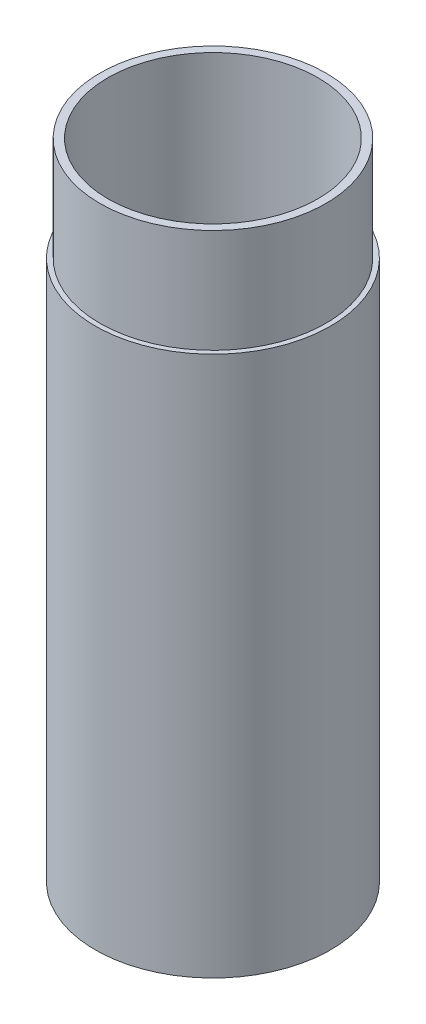
ISO-10303-21;
HEADER;
FILE_DESCRIPTION(('STEP AP214'),'2;1');
FILE_NAME('part.step','',(''),(''),'','','');
FILE_SCHEMA(('AUTOMOTIVE_DESIGN { 1 0 10303 214 1 1 1 1 }'));
ENDSEC;
DATA;
#1=APPLICATION_CONTEXT('core data for automotive mechanical design processes');
#2=APPLICATION_PROTOCOL_DEFINITION('international standard','automotive_design',2000,#1);
#3=PRODUCT_CONTEXT('',#1,'mechanical');
#4=PRODUCT('Part','Part','',(#3));
#5=PRODUCT_RELATED_PRODUCT_CATEGORY('part','',(#4));
#6=PRODUCT_DEFINITION_FORMATION('','',#4);
#7=PRODUCT_DEFINITION_CONTEXT('part definition',#1,'design');
#8=PRODUCT_DEFINITION('design','',#6,#7);
#9=PRODUCT_DEFINITION_SHAPE('','',#8);
#10=(LENGTH_UNIT() NAMED_UNIT(*) SI_UNIT(.MILLI.,.METRE.));
#11=(NAMED_UNIT(*) PLANE_ANGLE_UNIT() SI_UNIT($,.RADIAN.));
#12=(NAMED_UNIT(*) SI_UNIT($,.STERADIAN.) SOLID_ANGLE_UNIT());
#13=UNCERTAINTY_MEASURE_WITH_UNIT(LENGTH_MEASURE(1.E-05),#10,'distance_accuracy_value','');
#14=(GEOMETRIC_REPRESENTATION_CONTEXT(3) GLOBAL_UNCERTAINTY_ASSIGNED_CONTEXT((#13)) GLOBAL_UNIT_ASSIGNED_CONTEXT((#10,
#11,#12)) REPRESENTATION_CONTEXT('',''));
#15=CARTESIAN_POINT('',(0.,0.,0.));
#16=DIRECTION('',(0.,0.,1.));
#17=DIRECTION('',(1.,0.,0.));
#18=AXIS2_PLACEMENT_3D('',#15,#16,#17);
#19=CARTESIAN_POINT('',(0.,114.5,0.));
#20=DIRECTION('',(0.,1.,0.));
#21=DIRECTION('',(0.,0.,1.));
#22=AXIS2_PLACEMENT_3D('',#19,#20,#21);
#23=PLANE('',#22);
#24=CARTESIAN_POINT('',(0.,114.5,0.));
#25=DIRECTION('',(0.,1.,0.));
#26=DIRECTION('',(0.,0.,1.));
#27=AXIS2_PLACEMENT_3D('',#24,#25,#26);
#28=CIRCLE('',#27,23.95);
#29=CARTESIAN_POINT('',(0.,114.5,23.95));
#30=VERTEX_POINT('',#29);
#31=EDGE_CURVE('E58',#30,#30,#28,.T.);
#32=ORIENTED_EDGE('',*,*,#31,.F.);
#33=EDGE_LOOP('',(#32));
#34=FACE_BOUND('',#33,.T.);
#35=CARTESIAN_POINT('',(0.,114.5,0.));
#36=DIRECTION('',(0.,1.,0.));
#37=DIRECTION('',(0.,0.,1.));
#38=AXIS2_PLACEMENT_3D('',#35,#36,#37);
#39=CIRCLE('',#38,24.95);
#40=CARTESIAN_POINT('',(0.,114.5,-24.95));
#41=VERTEX_POINT('',#40);
#42=EDGE_CURVE('E62',#41,#41,#39,.T.);
#43=ORIENTED_EDGE('',*,*,#42,.T.);
#44=EDGE_LOOP('',(#43));
#45=FACE_BOUND('',#44,.T.);
#46=ADVANCED_FACE('F38',(#34,#45),#23,.T.);
#47=CARTESIAN_POINT('',(0.,0.,0.));
#48=DIRECTION('',(0.,1.,0.));
#49=DIRECTION('',(0.,0.,1.));
#50=AXIS2_PLACEMENT_3D('',#47,#48,#49);
#51=PLANE('',#50);
#52=CARTESIAN_POINT('',(0.,0.,0.));
#53=DIRECTION('',(0.,1.,0.));
#54=DIRECTION('',(0.,0.,1.));
#55=AXIS2_PLACEMENT_3D('',#52,#53,#54);
#56=CIRCLE('',#55,23.6642135623731);
#57=CARTESIAN_POINT('',(0.,0.,23.6642135623731));
#58=VERTEX_POINT('',#57);
#59=EDGE_CURVE('E53',#58,#58,#56,.T.);
#60=ORIENTED_EDGE('',*,*,#59,.T.);
#61=EDGE_LOOP('',(#60));
#62=FACE_BOUND('',#61,.T.);
#63=CARTESIAN_POINT('',(0.,0.,0.));
#64=DIRECTION('',(0.,1.,0.));
#65=DIRECTION('',(0.,0.,1.));
#66=AXIS2_PLACEMENT_3D('',#63,#64,#65);
#67=CIRCLE('',#66,24.95);
#68=CARTESIAN_POINT('',(0.,0.,-24.95));
#69=VERTEX_POINT('',#68);
#70=EDGE_CURVE('E59',#69,#69,#67,.T.);
#71=ORIENTED_EDGE('',*,*,#70,.F.);
#72=EDGE_LOOP('',(#71));
#73=FACE_BOUND('',#72,.T.);
#74=ADVANCED_FACE('F91',(#62,#73),#51,.F.);
#75=CARTESIAN_POINT('',(0.,114.5,0.));
#76=DIRECTION('',(0.,-1.,0.));
#77=DIRECTION('',(0.,0.,-1.));
#78=AXIS2_PLACEMENT_3D('',#75,#76,#77);
#79=CYLINDRICAL_SURFACE('',#78,24.95);
#80=CARTESIAN_POINT('',(0.,114.5,-24.95));
#81=CARTESIAN_POINT('',(0.,113.307291666667,-24.95));
#82=CARTESIAN_POINT('',(0.,112.114583333333,-24.95));
#83=CARTESIAN_POINT('',(0.,109.729166666667,-24.95));
#84=CARTESIAN_POINT('',(0.,108.536458333333,-24.95));
#85=CARTESIAN_POINT('',(0.,106.151041666667,-24.95));
#86=CARTESIAN_POINT('',(0.,104.958333333333,-24.95));
#87=CARTESIAN_POINT('',(0.,102.572916666667,-24.95));
#88=CARTESIAN_POINT('',(0.,101.380208333333,-24.95));
#89=CARTESIAN_POINT('',(0.,98.9947916666667,-24.95));
#90=CARTESIAN_POINT('',(0.,97.8020833333333,-24.95));
#91=CARTESIAN_POINT('',(0.,95.4166666666667,-24.95));
#92=CARTESIAN_POINT('',(0.,94.2239583333333,-24.95));
#93=CARTESIAN_POINT('',(0.,91.8385416666667,-24.95));
#94=CARTESIAN_POINT('',(0.,90.6458333333333,-24.95));
#95=CARTESIAN_POINT('',(0.,88.2604166666667,-24.95));
#96=CARTESIAN_POINT('',(0.,87.0677083333333,-24.95));
#97=CARTESIAN_POINT('',(0.,84.6822916666667,-24.95));
#98=CARTESIAN_POINT('',(0.,83.4895833333333,-24.95));
#99=CARTESIAN_POINT('',(0.,81.1041666666667,-24.95));
#100=CARTESIAN_POINT('',(0.,79.9114583333333,-24.95));
#101=CARTESIAN_POINT('',(0.,77.5260416666667,-24.95));
#102=CARTESIAN_POINT('',(0.,76.3333333333333,-24.95));
#103=CARTESIAN_POINT('',(0.,73.9479166666667,-24.95));
#104=CARTESIAN_POINT('',(0.,72.7552083333333,-24.95));
#105=CARTESIAN_POINT('',(0.,70.3697916666667,-24.95));
#106=CARTESIAN_POINT('',(0.,69.1770833333333,-24.95));
#107=CARTESIAN_POINT('',(0.,66.7916666666667,-24.95));
#108=CARTESIAN_POINT('',(0.,65.5989583333333,-24.95));
#109=CARTESIAN_POINT('',(0.,63.2135416666667,-24.95));
#110=CARTESIAN_POINT('',(0.,62.0208333333333,-24.95));
#111=CARTESIAN_POINT('',(0.,59.6354166666667,-24.95));
#112=CARTESIAN_POINT('',(0.,58.4427083333333,-24.95));
#113=CARTESIAN_POINT('',(0.,56.0572916666667,-24.95));
#114=CARTESIAN_POINT('',(0.,54.8645833333333,-24.95));
#115=CARTESIAN_POINT('',(0.,52.4791666666667,-24.95));
#116=CARTESIAN_POINT('',(0.,51.2864583333333,-24.95));
#117=CARTESIAN_POINT('',(0.,48.9010416666667,-24.95));
#118=CARTESIAN_POINT('',(0.,47.7083333333333,-24.95));
#119=CARTESIAN_POINT('',(0.,45.3229166666667,-24.95));
#120=CARTESIAN_POINT('',(0.,44.1302083333333,-24.95));
#121=CARTESIAN_POINT('',(0.,41.7447916666667,-24.95));
#122=CARTESIAN_POINT('',(0.,40.5520833333333,-24.95));
#123=CARTESIAN_POINT('',(0.,38.1666666666667,-24.95));
#124=CARTESIAN_POINT('',(0.,36.9739583333333,-24.95));
#125=CARTESIAN_POINT('',(0.,34.5885416666667,-24.95));
#126=CARTESIAN_POINT('',(0.,33.3958333333333,-24.95));
#127=CARTESIAN_POINT('',(0.,31.0104166666667,-24.95));
#128=CARTESIAN_POINT('',(0.,29.8177083333333,-24.95));
#129=CARTESIAN_POINT('',(0.,27.4322916666667,-24.95));
#130=CARTESIAN_POINT('',(0.,26.2395833333333,-24.95));
#131=CARTESIAN_POINT('',(0.,23.8541666666667,-24.95));
#132=CARTESIAN_POINT('',(0.,22.6614583333333,-24.95));
#133=CARTESIAN_POINT('',(0.,20.2760416666667,-24.95));
#134=CARTESIAN_POINT('',(0.,19.0833333333333,-24.95));
#135=CARTESIAN_POINT('',(0.,16.6979166666667,-24.95));
#136=CARTESIAN_POINT('',(0.,15.5052083333333,-24.95));
#137=CARTESIAN_POINT('',(0.,13.1197916666667,-24.95));
#138=CARTESIAN_POINT('',(0.,11.9270833333333,-24.95));
#139=CARTESIAN_POINT('',(0.,9.54166666666667,-24.95));
#140=CARTESIAN_POINT('',(0.,8.34895833333334,-24.95));
#141=CARTESIAN_POINT('',(0.,5.96354166666667,-24.95));
#142=CARTESIAN_POINT('',(0.,4.77083333333334,-24.95));
#143=CARTESIAN_POINT('',(0.,2.38541666666667,-24.95));
#144=CARTESIAN_POINT('',(0.,1.19270833333333,-24.95));
#145=CARTESIAN_POINT('',(0.,0.,-24.95));
#146=B_SPLINE_CURVE_WITH_KNOTS('',3,(#80,#81,#82,#83,#84,#85,#86,#87,#88,#89,#90,#91,#92,#93,
#94,#95,#96,#97,#98,#99,#100,#101,#102,#103,#104,#105,#106,#107,#108,#109,#110,#111,#112,#113,
#114,#115,#116,#117,#118,#119,#120,#121,#122,#123,#124,#125,#126,#127,#128,#129,#130,#131,#132,
#133,#134,#135,#136,#137,#138,#139,#140,#141,#142,#143,#144,#145),.UNSPECIFIED.,.F.,.F.,(4,2,2,
2,2,2,2,2,2,2,2,2,2,2,2,2,2,2,2,2,2,2,2,2,2,2,2,2,2,2,2,2,4),(0.,3.57812499999999,
7.15624999999999,10.734375,14.3125,17.890625,21.46875,25.046875,28.625,32.203125,35.78125,
39.359375,42.9375,46.515625,50.09375,53.671875,57.25,60.828125,64.40625,67.984375,71.5625,
75.140625,78.71875,82.296875,85.875,89.453125,93.03125,96.609375,100.1875,103.765625,107.34375,
110.921875,114.5),.UNSPECIFIED.);
#147=EDGE_CURVE('BSEAM88',#41,#69,#146,.T.);
#148=ORIENTED_EDGE('',*,*,#42,.F.);
#149=ORIENTED_EDGE('',*,*,#70,.T.);
#150=ORIENTED_EDGE('',*,*,#147,.T.);
#151=ORIENTED_EDGE('',*,*,#147,.F.);
#152=EDGE_LOOP('',(#148,#150,#149,#151));
#153=FACE_BOUND('',#152,.T.);
#154=ADVANCED_FACE('F88',(#153),#79,.T.);
#155=CARTESIAN_POINT('',(0.,114.5,0.));
#156=DIRECTION('',(0.,-1.,0.));
#157=DIRECTION('',(0.,0.,-1.));
#158=AXIS2_PLACEMENT_3D('',#155,#156,#157);
#159=CYLINDRICAL_SURFACE('',#158,22.25);
#160=CARTESIAN_POINT('',(0.,1.41421356237306,0.));
#161=DIRECTION('',(0.,1.,0.));
#162=DIRECTION('',(0.,0.,1.));
#163=AXIS2_PLACEMENT_3D('',#160,#161,#162);
#164=CIRCLE('',#163,22.25);
#165=CARTESIAN_POINT('',(0.,1.41421356237306,-22.25));
#166=VERTEX_POINT('',#165);
#167=EDGE_CURVE('E10',#166,#166,#164,.F.);
#168=CARTESIAN_POINT('',(0.,136.5,0.));
#169=DIRECTION('',(0.,1.,0.));
#170=DIRECTION('',(0.,0.,1.));
#171=AXIS2_PLACEMENT_3D('',#168,#169,#170);
#172=CIRCLE('',#171,22.25);
#173=CARTESIAN_POINT('',(0.,136.5,-22.25));
#174=VERTEX_POINT('',#173);
#175=EDGE_CURVE('E70',#174,#174,#172,.T.);
#176=CARTESIAN_POINT('',(0.,1.41421356237306,-22.25));
#177=CARTESIAN_POINT('',(0.,2.82135717109835,-22.25));
#178=CARTESIAN_POINT('',(0.,4.22850077982363,-22.25));
#179=CARTESIAN_POINT('',(0.,7.04278799727419,-22.25));
#180=CARTESIAN_POINT('',(0.,8.44993160599947,-22.25));
#181=CARTESIAN_POINT('',(0.,11.26421882345,-22.25));
#182=CARTESIAN_POINT('',(0.,12.6713624321753,-22.25));
#183=CARTESIAN_POINT('',(0.,15.4856496496259,-22.25));
#184=CARTESIAN_POINT('',(0.,16.8927932583511,-22.25));
#185=CARTESIAN_POINT('',(0.,19.7070804758017,-22.25));
#186=CARTESIAN_POINT('',(0.,21.114224084527,-22.25));
#187=CARTESIAN_POINT('',(0.,23.9285113019776,-22.25));
#188=CARTESIAN_POINT('',(0.,25.3356549107028,-22.25));
#189=CARTESIAN_POINT('',(0.,28.1499421281534,-22.25));
#190=CARTESIAN_POINT('',(0.,29.5570857368787,-22.25));
#191=CARTESIAN_POINT('',(0.,32.3713729543292,-22.25));
#192=CARTESIAN_POINT('',(0.,33.7785165630545,-22.25));
#193=CARTESIAN_POINT('',(0.,36.5928037805051,-22.25));
#194=CARTESIAN_POINT('',(0.,37.9999473892304,-22.25));
#195=CARTESIAN_POINT('',(0.,40.8142346066809,-22.25));
#196=CARTESIAN_POINT('',(0.,42.2213782154062,-22.25));
#197=CARTESIAN_POINT('',(0.,45.0356654328568,-22.25));
#198=CARTESIAN_POINT('',(0.,46.442809041582,-22.25));
#199=CARTESIAN_POINT('',(0.,49.2570962590326,-22.25));
#200=CARTESIAN_POINT('',(0.,50.6642398677579,-22.25));
#201=CARTESIAN_POINT('',(0.,53.4785270852084,-22.25));
#202=CARTESIAN_POINT('',(0.,54.8856706939337,-22.25));
#203=CARTESIAN_POINT('',(0.,57.6999579113843,-22.25));
#204=CARTESIAN_POINT('',(0.,59.1071015201096,-22.25));
#205=CARTESIAN_POINT('',(0.,61.9213887375601,-22.25));
#206=CARTESIAN_POINT('',(0.,63.3285323462854,-22.25));
#207=CARTESIAN_POINT('',(0.,66.142819563736,-22.25));
#208=CARTESIAN_POINT('',(0.,67.5499631724612,-22.25));
#209=CARTESIAN_POINT('',(0.,70.3642503899118,-22.25));
#210=CARTESIAN_POINT('',(0.,71.7713939986371,-22.25));
#211=CARTESIAN_POINT('',(0.,74.5856812160877,-22.25));
#212=CARTESIAN_POINT('',(0.,75.9928248248129,-22.25));
#213=CARTESIAN_POINT('',(0.,78.8071120422635,-22.25));
#214=CARTESIAN_POINT('',(0.,80.2142556509888,-22.25));
#215=CARTESIAN_POINT('',(0.,83.0285428684393,-22.25));
#216=CARTESIAN_POINT('',(0.,84.4356864771646,-22.25));
#217=CARTESIAN_POINT('',(0.,87.2499736946152,-22.25));
#218=CARTESIAN_POINT('',(0.,88.6571173033405,-22.25));
#219=CARTESIAN_POINT('',(0.,91.471404520791,-22.25));
#220=CARTESIAN_POINT('',(0.,92.8785481295163,-22.25));
#221=CARTESIAN_POINT('',(0.,95.6928353469668,-22.25));
#222=CARTESIAN_POINT('',(0.,97.0999789556921,-22.25));
#223=CARTESIAN_POINT('',(0.,99.9142661731427,-22.25));
#224=CARTESIAN_POINT('',(0.,101.321409781868,-22.25));
#225=CARTESIAN_POINT('',(0.,104.135696999319,-22.25));
#226=CARTESIAN_POINT('',(0.,105.542840608044,-22.25));
#227=CARTESIAN_POINT('',(0.,108.357127825494,-22.25));
#228=CARTESIAN_POINT('',(0.,109.76427143422,-22.25));
#229=CARTESIAN_POINT('',(0.,112.57855865167,-22.25));
#230=CARTESIAN_POINT('',(0.,113.985702260395,-22.25));
#231=CARTESIAN_POINT('',(0.,116.799989477846,-22.25));
#232=CARTESIAN_POINT('',(0.,118.207133086571,-22.25));
#233=CARTESIAN_POINT('',(0.,121.021420304022,-22.25));
#234=CARTESIAN_POINT('',(0.,122.428563912747,-22.25));
#235=CARTESIAN_POINT('',(0.,125.242851130198,-22.25));
#236=CARTESIAN_POINT('',(0.,126.649994738923,-22.25));
#237=CARTESIAN_POINT('',(0.,129.464281956374,-22.25));
#238=CARTESIAN_POINT('',(0.,130.871425565099,-22.25));
#239=CARTESIAN_POINT('',(0.,133.685712782549,-22.25));
#240=CARTESIAN_POINT('',(0.,135.092856391275,-22.25));
#241=CARTESIAN_POINT('',(0.,136.5,-22.25));
#242=B_SPLINE_CURVE_WITH_KNOTS('',3,(#176,#177,#178,#179,#180,#181,#182,#183,#184,#185,#186,
#187,#188,#189,#190,#191,#192,#193,#194,#195,#196,#197,#198,#199,#200,#201,#202,#203,#204,#205,
#206,#207,#208,#209,#210,#211,#212,#213,#214,#215,#216,#217,#218,#219,#220,#221,#222,#223,#224,
#225,#226,#227,#228,#229,#230,#231,#232,#233,#234,#235,#236,#237,#238,#239,#240,#241),
.UNSPECIFIED.,.F.,.F.,(4,2,2,2,2,2,2,2,2,2,2,2,2,2,2,2,2,2,2,2,2,2,2,2,2,2,2,2,2,2,2,2,4),(0.,
4.22143082617585,8.44286165235168,12.6642924785275,16.8857233047034,21.1071541308792,
25.3285849570551,29.5500157832309,33.7714466094067,37.9928774355826,42.2143082617584,
46.4357390879343,50.6571699141101,54.8786007402859,59.1000315664618,63.3214623926376,
67.5428932188135,71.7643240449893,75.9857548711652,80.207185697341,84.4286165235168,
88.6500473496927,92.8714781758685,97.0929090020444,101.31433982822,105.535770654396,
109.757201480572,113.978632306748,118.200063132924,122.421493959099,126.642924785275,
130.864355611451,135.085786437627),.UNSPECIFIED.);
#243=EDGE_CURVE('BSEAM74',#166,#174,#242,.T.);
#244=ORIENTED_EDGE('',*,*,#167,.T.);
#245=ORIENTED_EDGE('',*,*,#175,.T.);
#246=ORIENTED_EDGE('',*,*,#243,.T.);
#247=ORIENTED_EDGE('',*,*,#243,.F.);
#248=EDGE_LOOP('',(#244,#246,#245,#247));
#249=FACE_BOUND('',#248,.T.);
#250=ADVANCED_FACE('F74',(#249),#159,.F.);
#251=CARTESIAN_POINT('',(0.,136.5,0.));
#252=DIRECTION('',(0.,1.,0.));
#253=DIRECTION('',(0.,0.,1.));
#254=AXIS2_PLACEMENT_3D('',#251,#252,#253);
#255=PLANE('',#254);
#256=CARTESIAN_POINT('',(0.,136.5,0.));
#257=DIRECTION('',(0.,1.,0.));
#258=DIRECTION('',(0.,0.,1.));
#259=AXIS2_PLACEMENT_3D('',#256,#257,#258);
#260=CIRCLE('',#259,23.95);
#261=CARTESIAN_POINT('',(0.,136.5,23.95));
#262=VERTEX_POINT('',#261);
#263=EDGE_CURVE('E63',#262,#262,#260,.T.);
#264=ORIENTED_EDGE('',*,*,#263,.T.);
#265=EDGE_LOOP('',(#264));
#266=FACE_BOUND('',#265,.T.);
#267=ORIENTED_EDGE('',*,*,#175,.F.);
#268=EDGE_LOOP('',(#267));
#269=FACE_BOUND('',#268,.T.);
#270=ADVANCED_FACE('F76',(#266,#269),#255,.T.);
#271=CARTESIAN_POINT('',(0.,136.5,0.));
#272=DIRECTION('',(0.,-1.,0.));
#273=DIRECTION('',(0.,0.,-1.));
#274=AXIS2_PLACEMENT_3D('',#271,#272,#273);
#275=CYLINDRICAL_SURFACE('',#274,23.95);
#276=ORIENTED_EDGE('',*,*,#263,.F.);
#277=EDGE_LOOP('',(#276));
#278=FACE_BOUND('',#277,.T.);
#279=ORIENTED_EDGE('',*,*,#31,.T.);
#280=EDGE_LOOP('',(#279));
#281=FACE_BOUND('',#280,.T.);
#282=ADVANCED_FACE('F78',(#278,#281),#275,.T.);
#283=CARTESIAN_POINT('',(0.,0.,0.));
#284=DIRECTION('',(0.,-1.,0.));
#285=DIRECTION('',(0.,0.,-1.));
#286=AXIS2_PLACEMENT_3D('',#283,#284,#285);
#287=CONICAL_SURFACE('',#286,23.25,0.785398163397443);
#288=CARTESIAN_POINT('',(0.,0.292893218813452,0.));
#289=DIRECTION('',(0.,-1.,0.));
#290=DIRECTION('',(0.,0.,-1.));
#291=AXIS2_PLACEMENT_3D('',#288,#289,#290);
#292=CIRCLE('',#291,22.9571067811865);
#293=CARTESIAN_POINT('',(0.,0.292893218813452,-22.9571067811865));
#294=VERTEX_POINT('',#293);
#295=EDGE_CURVE('E45',#294,#294,#292,.T.);
#296=ORIENTED_EDGE('',*,*,#295,.T.);
#297=EDGE_LOOP('',(#296));
#298=FACE_BOUND('',#297,.T.);
#299=CARTESIAN_POINT('',(0.,0.707106781186521,0.));
#300=DIRECTION('',(0.,1.,0.));
#301=DIRECTION('',(0.,0.,1.));
#302=AXIS2_PLACEMENT_3D('',#299,#300,#301);
#303=CIRCLE('',#302,22.5428932188135);
#304=CARTESIAN_POINT('',(0.,0.707106781186521,22.5428932188135));
#305=VERTEX_POINT('',#304);
#306=EDGE_CURVE('E49',#305,#305,#303,.T.);
#307=ORIENTED_EDGE('',*,*,#306,.T.);
#308=EDGE_LOOP('',(#307));
#309=FACE_BOUND('',#308,.T.);
#310=ADVANCED_FACE('F85',(#298,#309),#287,.F.);
#311=CARTESIAN_POINT('',(0.,1.,0.));
#312=DIRECTION('',(0.,1.,0.));
#313=DIRECTION('',(0.,0.,1.));
#314=AXIS2_PLACEMENT_3D('',#311,#312,#313);
#315=TOROIDAL_SURFACE('',#314,23.6642135623731,1.);
#316=ORIENTED_EDGE('',*,*,#295,.F.);
#317=EDGE_LOOP('',(#316));
#318=FACE_BOUND('',#317,.T.);
#319=ORIENTED_EDGE('',*,*,#59,.F.);
#320=EDGE_LOOP('',(#319));
#321=FACE_BOUND('',#320,.T.);
#322=ADVANCED_FACE('F109',(#318,#321),#315,.T.);
#323=CARTESIAN_POINT('',(0.,1.41421356237306,0.));
#324=DIRECTION('',(0.,1.,0.));
#325=DIRECTION('',(0.,0.,1.));
#326=AXIS2_PLACEMENT_3D('',#323,#324,#325);
#327=TOROIDAL_SURFACE('',#326,23.25,1.);
#328=ORIENTED_EDGE('',*,*,#306,.F.);
#329=EDGE_LOOP('',(#328));
#330=FACE_BOUND('',#329,.T.);
#331=ORIENTED_EDGE('',*,*,#167,.F.);
#332=EDGE_LOOP('',(#331));
#333=FACE_BOUND('',#332,.T.);
#334=ADVANCED_FACE('F40',(#330,#333),#327,.T.);
#335=CLOSED_SHELL('',(#46,#74,#154,#250,#270,#282,#310,#322,#334));
#336=MANIFOLD_SOLID_BREP('B2',#335);
#337=ADVANCED_BREP_SHAPE_REPRESENTATION('',(#18,#336),#14);
#338=SHAPE_DEFINITION_REPRESENTATION(#9,#337);
ENDSEC;
END-ISO-10303-21;
